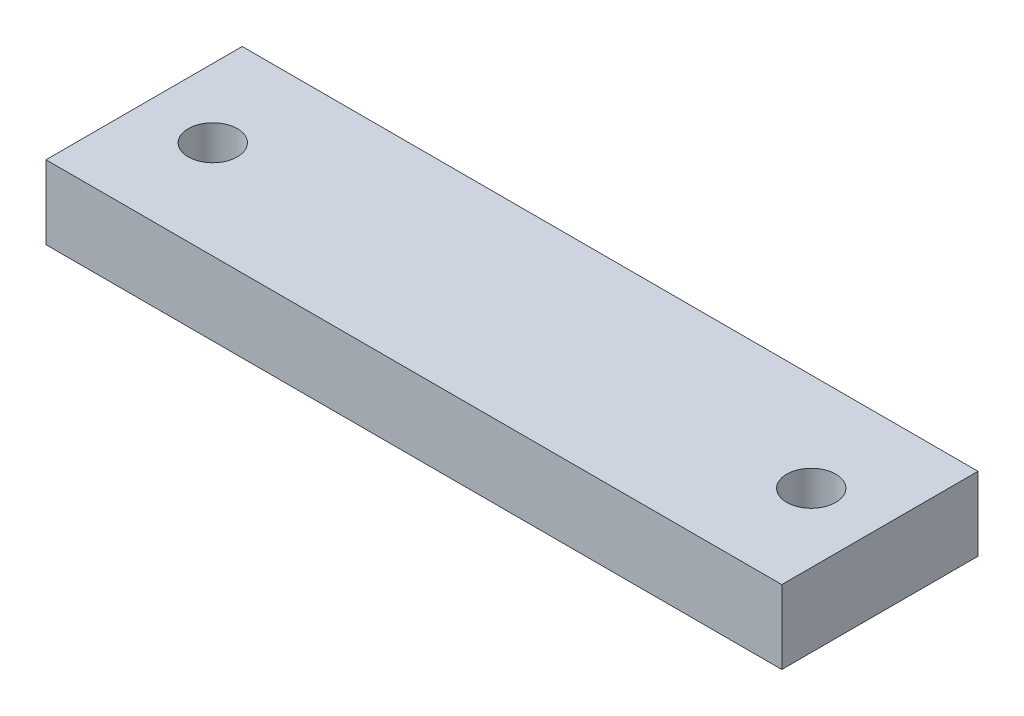
ISO-10303-21;
HEADER;
FILE_DESCRIPTION(('STEP AP214'),'2;1');
FILE_NAME('part.step','',(''),(''),'','','');
FILE_SCHEMA(('AUTOMOTIVE_DESIGN { 1 0 10303 214 1 1 1 1 }'));
ENDSEC;
DATA;
#1=APPLICATION_CONTEXT('core data for automotive mechanical design processes');
#2=APPLICATION_PROTOCOL_DEFINITION('international standard','automotive_design',2000,#1);
#3=PRODUCT_CONTEXT('',#1,'mechanical');
#4=PRODUCT('Part','Part','',(#3));
#5=PRODUCT_RELATED_PRODUCT_CATEGORY('part','',(#4));
#6=PRODUCT_DEFINITION_FORMATION('','',#4);
#7=PRODUCT_DEFINITION_CONTEXT('part definition',#1,'design');
#8=PRODUCT_DEFINITION('design','',#6,#7);
#9=PRODUCT_DEFINITION_SHAPE('','',#8);
#10=(LENGTH_UNIT() NAMED_UNIT(*) SI_UNIT(.MILLI.,.METRE.));
#11=(NAMED_UNIT(*) PLANE_ANGLE_UNIT() SI_UNIT($,.RADIAN.));
#12=(NAMED_UNIT(*) SI_UNIT($,.STERADIAN.) SOLID_ANGLE_UNIT());
#13=UNCERTAINTY_MEASURE_WITH_UNIT(LENGTH_MEASURE(1.E-05),#10,'distance_accuracy_value','');
#14=(GEOMETRIC_REPRESENTATION_CONTEXT(3) GLOBAL_UNCERTAINTY_ASSIGNED_CONTEXT((#13)) GLOBAL_UNIT_ASSIGNED_CONTEXT((#10,
#11,#12)) REPRESENTATION_CONTEXT('',''));
#15=CARTESIAN_POINT('',(0.,0.,0.));
#16=DIRECTION('',(0.,0.,1.));
#17=DIRECTION('',(1.,0.,0.));
#18=AXIS2_PLACEMENT_3D('',#15,#16,#17);
#19=CARTESIAN_POINT('',(0.,30.,0.));
#20=DIRECTION('',(1.,0.,0.));
#21=DIRECTION('',(0.,0.,-1.));
#22=AXIS2_PLACEMENT_3D('',#19,#20,#21);
#23=PLANE('',#22);
#24=DIRECTION('',(0.,0.,1.));
#25=VECTOR('',#24,1.);
#26=CARTESIAN_POINT('',(0.,0.,0.));
#27=LINE('',#26,#25);
#28=CARTESIAN_POINT('',(0.,0.,-80.));
#29=VERTEX_POINT('',#28);
#30=CARTESIAN_POINT('',(0.,0.,0.));
#31=VERTEX_POINT('',#30);
#32=EDGE_CURVE('E115',#29,#31,#27,.T.);
#33=ORIENTED_EDGE('',*,*,#32,.T.);
#34=DIRECTION('',(0.,-1.,0.));
#35=VECTOR('',#34,1.);
#36=CARTESIAN_POINT('',(0.,30.,0.));
#37=LINE('',#36,#35);
#38=CARTESIAN_POINT('',(0.,30.,0.));
#39=VERTEX_POINT('',#38);
#40=EDGE_CURVE('E11',#39,#31,#37,.T.);
#41=ORIENTED_EDGE('',*,*,#40,.F.);
#42=DIRECTION('',(0.,0.,1.));
#43=VECTOR('',#42,1.);
#44=CARTESIAN_POINT('',(0.,30.,0.));
#45=LINE('',#44,#43);
#46=CARTESIAN_POINT('',(0.,30.,-80.));
#47=VERTEX_POINT('',#46);
#48=EDGE_CURVE('E96',#47,#39,#45,.T.);
#49=ORIENTED_EDGE('',*,*,#48,.F.);
#50=DIRECTION('',(0.,-1.,0.));
#51=VECTOR('',#50,1.);
#52=CARTESIAN_POINT('',(0.,30.,-80.));
#53=LINE('',#52,#51);
#54=EDGE_CURVE('E107',#47,#29,#53,.T.);
#55=ORIENTED_EDGE('',*,*,#54,.T.);
#56=EDGE_LOOP('',(#33,#41,#49,#55));
#57=FACE_BOUND('',#56,.T.);
#58=ADVANCED_FACE('F42',(#57),#23,.F.);
#59=CARTESIAN_POINT('',(0.,30.,0.));
#60=DIRECTION('',(0.,0.,-1.));
#61=DIRECTION('',(-1.,0.,0.));
#62=AXIS2_PLACEMENT_3D('',#59,#60,#61);
#63=PLANE('',#62);
#64=DIRECTION('',(1.,0.,0.));
#65=VECTOR('',#64,1.);
#66=CARTESIAN_POINT('',(0.,0.,0.));
#67=LINE('',#66,#65);
#68=CARTESIAN_POINT('',(300.,0.,0.));
#69=VERTEX_POINT('',#68);
#70=EDGE_CURVE('E101',#31,#69,#67,.T.);
#71=ORIENTED_EDGE('',*,*,#70,.T.);
#72=DIRECTION('',(0.,-1.,0.));
#73=VECTOR('',#72,1.);
#74=CARTESIAN_POINT('',(300.,30.,0.));
#75=LINE('',#74,#73);
#76=CARTESIAN_POINT('',(300.,30.,0.));
#77=VERTEX_POINT('',#76);
#78=EDGE_CURVE('E52',#77,#69,#75,.T.);
#79=ORIENTED_EDGE('',*,*,#78,.F.);
#80=DIRECTION('',(1.,0.,0.));
#81=VECTOR('',#80,1.);
#82=CARTESIAN_POINT('',(0.,30.,0.));
#83=LINE('',#82,#81);
#84=EDGE_CURVE('E93',#39,#77,#83,.T.);
#85=ORIENTED_EDGE('',*,*,#84,.F.);
#86=ORIENTED_EDGE('',*,*,#40,.T.);
#87=EDGE_LOOP('',(#71,#79,#85,#86));
#88=FACE_BOUND('',#87,.T.);
#89=ADVANCED_FACE('F99',(#88),#63,.F.);
#90=CARTESIAN_POINT('',(300.,30.,0.));
#91=DIRECTION('',(-1.,0.,0.));
#92=DIRECTION('',(0.,0.,1.));
#93=AXIS2_PLACEMENT_3D('',#90,#91,#92);
#94=PLANE('',#93);
#95=DIRECTION('',(0.,0.,-1.));
#96=VECTOR('',#95,1.);
#97=CARTESIAN_POINT('',(300.,0.,0.));
#98=LINE('',#97,#96);
#99=CARTESIAN_POINT('',(300.,0.,-80.));
#100=VERTEX_POINT('',#99);
#101=EDGE_CURVE('E80',#69,#100,#98,.T.);
#102=ORIENTED_EDGE('',*,*,#101,.T.);
#103=DIRECTION('',(0.,-1.,0.));
#104=VECTOR('',#103,1.);
#105=CARTESIAN_POINT('',(300.,30.,-80.));
#106=LINE('',#105,#104);
#107=CARTESIAN_POINT('',(300.,30.,-80.));
#108=VERTEX_POINT('',#107);
#109=EDGE_CURVE('E103',#108,#100,#106,.T.);
#110=ORIENTED_EDGE('',*,*,#109,.F.);
#111=DIRECTION('',(0.,0.,-1.));
#112=VECTOR('',#111,1.);
#113=CARTESIAN_POINT('',(300.,30.,0.));
#114=LINE('',#113,#112);
#115=EDGE_CURVE('E94',#77,#108,#114,.T.);
#116=ORIENTED_EDGE('',*,*,#115,.F.);
#117=ORIENTED_EDGE('',*,*,#78,.T.);
#118=EDGE_LOOP('',(#102,#110,#116,#117));
#119=FACE_BOUND('',#118,.T.);
#120=ADVANCED_FACE('F102',(#119),#94,.F.);
#121=CARTESIAN_POINT('',(0.,30.,-80.));
#122=DIRECTION('',(0.,0.,1.));
#123=DIRECTION('',(1.,0.,0.));
#124=AXIS2_PLACEMENT_3D('',#121,#122,#123);
#125=PLANE('',#124);
#126=DIRECTION('',(-1.,0.,0.));
#127=VECTOR('',#126,1.);
#128=CARTESIAN_POINT('',(0.,0.,-80.));
#129=LINE('',#128,#127);
#130=EDGE_CURVE('E83',#100,#29,#129,.T.);
#131=ORIENTED_EDGE('',*,*,#130,.T.);
#132=ORIENTED_EDGE('',*,*,#54,.F.);
#133=DIRECTION('',(-1.,0.,0.));
#134=VECTOR('',#133,1.);
#135=CARTESIAN_POINT('',(0.,30.,-80.));
#136=LINE('',#135,#134);
#137=EDGE_CURVE('E64',#108,#47,#136,.T.);
#138=ORIENTED_EDGE('',*,*,#137,.F.);
#139=ORIENTED_EDGE('',*,*,#109,.T.);
#140=EDGE_LOOP('',(#131,#132,#138,#139));
#141=FACE_BOUND('',#140,.T.);
#142=ADVANCED_FACE('F127',(#141),#125,.F.);
#143=CARTESIAN_POINT('',(0.,30.,0.));
#144=DIRECTION('',(0.,-1.,0.));
#145=DIRECTION('',(0.,0.,-1.));
#146=AXIS2_PLACEMENT_3D('',#143,#144,#145);
#147=PLANE('',#146);
#148=CARTESIAN_POINT('',(28.,30.,-40.));
#149=DIRECTION('',(0.,1.,0.));
#150=DIRECTION('',(0.,0.,1.));
#151=AXIS2_PLACEMENT_3D('',#148,#149,#150);
#152=CIRCLE('',#151,9.99999999999999);
#153=CARTESIAN_POINT('',(28.,30.,-30.));
#154=VERTEX_POINT('',#153);
#155=EDGE_CURVE('E143',#154,#154,#152,.T.);
#156=ORIENTED_EDGE('',*,*,#155,.F.);
#157=EDGE_LOOP('',(#156));
#158=FACE_BOUND('',#157,.T.);
#159=CARTESIAN_POINT('',(272.,30.,-40.));
#160=DIRECTION('',(0.,1.,0.));
#161=DIRECTION('',(0.,0.,1.));
#162=AXIS2_PLACEMENT_3D('',#159,#160,#161);
#163=CIRCLE('',#162,9.99999999999998);
#164=CARTESIAN_POINT('',(272.,30.,-30.));
#165=VERTEX_POINT('',#164);
#166=EDGE_CURVE('E137',#165,#165,#163,.T.);
#167=ORIENTED_EDGE('',*,*,#166,.F.);
#168=EDGE_LOOP('',(#167));
#169=FACE_BOUND('',#168,.T.);
#170=ORIENTED_EDGE('',*,*,#48,.T.);
#171=ORIENTED_EDGE('',*,*,#84,.T.);
#172=ORIENTED_EDGE('',*,*,#115,.T.);
#173=ORIENTED_EDGE('',*,*,#137,.T.);
#174=EDGE_LOOP('',(#170,#171,#172,#173));
#175=FACE_BOUND('',#174,.T.);
#176=ADVANCED_FACE('F95',(#158,#169,#175),#147,.F.);
#177=CARTESIAN_POINT('',(0.,0.,0.));
#178=DIRECTION('',(0.,-1.,0.));
#179=DIRECTION('',(0.,0.,-1.));
#180=AXIS2_PLACEMENT_3D('',#177,#178,#179);
#181=PLANE('',#180);
#182=CARTESIAN_POINT('',(28.,0.,-40.));
#183=DIRECTION('',(0.,1.,0.));
#184=DIRECTION('',(0.,0.,1.));
#185=AXIS2_PLACEMENT_3D('',#182,#183,#184);
#186=CIRCLE('',#185,9.99999999999999);
#187=CARTESIAN_POINT('',(28.,0.,-30.));
#188=VERTEX_POINT('',#187);
#189=EDGE_CURVE('E119',#188,#188,#186,.T.);
#190=ORIENTED_EDGE('',*,*,#189,.T.);
#191=EDGE_LOOP('',(#190));
#192=FACE_BOUND('',#191,.T.);
#193=CARTESIAN_POINT('',(272.,0.,-40.));
#194=DIRECTION('',(0.,1.,0.));
#195=DIRECTION('',(0.,0.,1.));
#196=AXIS2_PLACEMENT_3D('',#193,#194,#195);
#197=CIRCLE('',#196,9.99999999999998);
#198=CARTESIAN_POINT('',(272.,0.,-30.));
#199=VERTEX_POINT('',#198);
#200=EDGE_CURVE('E135',#199,#199,#197,.T.);
#201=ORIENTED_EDGE('',*,*,#200,.T.);
#202=EDGE_LOOP('',(#201));
#203=FACE_BOUND('',#202,.T.);
#204=ORIENTED_EDGE('',*,*,#32,.F.);
#205=ORIENTED_EDGE('',*,*,#130,.F.);
#206=ORIENTED_EDGE('',*,*,#101,.F.);
#207=ORIENTED_EDGE('',*,*,#70,.F.);
#208=EDGE_LOOP('',(#204,#205,#206,#207));
#209=FACE_BOUND('',#208,.T.);
#210=ADVANCED_FACE('F129',(#192,#203,#209),#181,.T.);
#211=CARTESIAN_POINT('',(272.,0.,-40.));
#212=DIRECTION('',(0.,1.,0.));
#213=DIRECTION('',(0.,0.,1.));
#214=AXIS2_PLACEMENT_3D('',#211,#212,#213);
#215=CYLINDRICAL_SURFACE('',#214,9.99999999999998);
#216=ORIENTED_EDGE('',*,*,#200,.F.);
#217=EDGE_LOOP('',(#216));
#218=FACE_BOUND('',#217,.T.);
#219=ORIENTED_EDGE('',*,*,#166,.T.);
#220=EDGE_LOOP('',(#219));
#221=FACE_BOUND('',#220,.T.);
#222=ADVANCED_FACE('F152',(#218,#221),#215,.F.);
#223=CARTESIAN_POINT('',(28.,0.,-40.));
#224=DIRECTION('',(0.,1.,0.));
#225=DIRECTION('',(0.,0.,1.));
#226=AXIS2_PLACEMENT_3D('',#223,#224,#225);
#227=CYLINDRICAL_SURFACE('',#226,9.99999999999999);
#228=ORIENTED_EDGE('',*,*,#189,.F.);
#229=EDGE_LOOP('',(#228));
#230=FACE_BOUND('',#229,.T.);
#231=ORIENTED_EDGE('',*,*,#155,.T.);
#232=EDGE_LOOP('',(#231));
#233=FACE_BOUND('',#232,.T.);
#234=ADVANCED_FACE('F151',(#230,#233),#227,.F.);
#235=CLOSED_SHELL('',(#58,#89,#120,#142,#176,#210,#222,#234));
#236=MANIFOLD_SOLID_BREP('B2',#235);
#237=ADVANCED_BREP_SHAPE_REPRESENTATION('',(#18,#236),#14);
#238=SHAPE_DEFINITION_REPRESENTATION(#9,#237);
ENDSEC;
END-ISO-10303-21;
